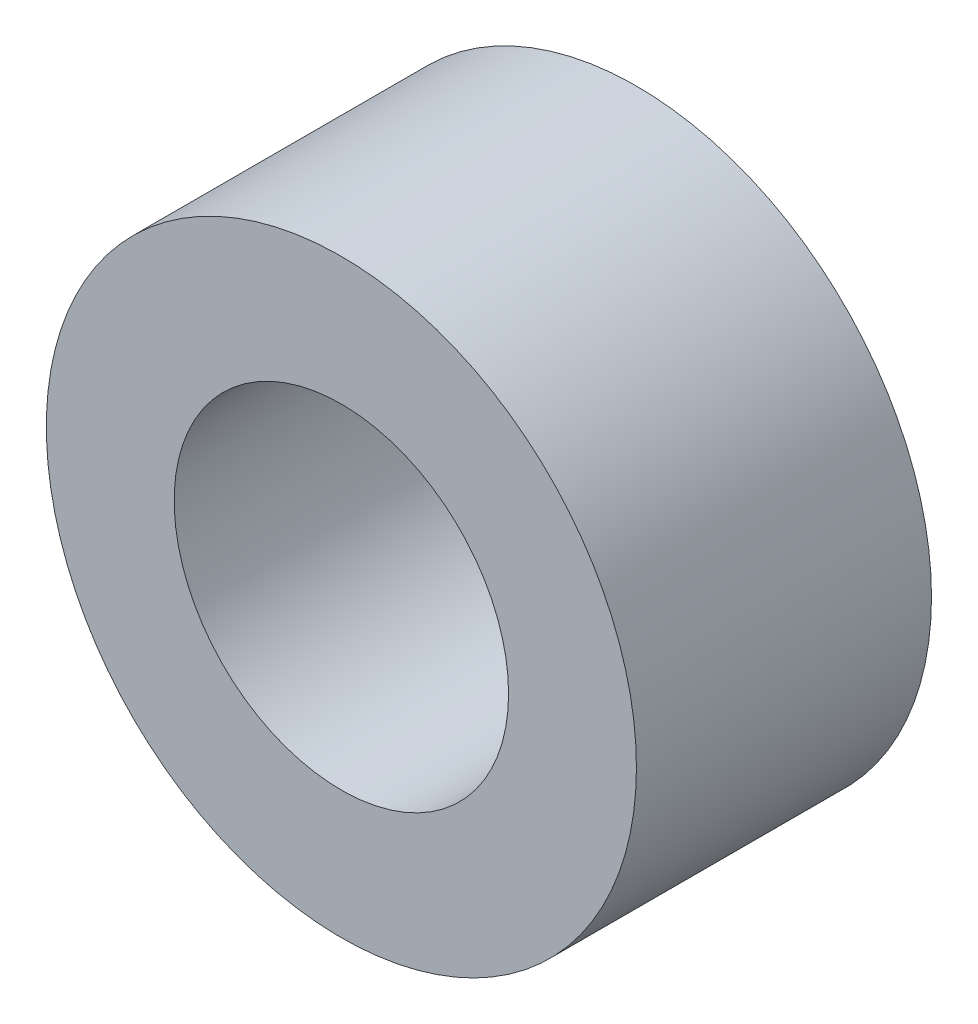
ISO-10303-21;
HEADER;
FILE_DESCRIPTION(('STEP AP214'),'2;1');
FILE_NAME('part.step','',(''),(''),'','','');
FILE_SCHEMA(('AUTOMOTIVE_DESIGN { 1 0 10303 214 1 1 1 1 }'));
ENDSEC;
DATA;
#1=APPLICATION_CONTEXT('core data for automotive mechanical design processes');
#2=APPLICATION_PROTOCOL_DEFINITION('international standard','automotive_design',2000,#1);
#3=PRODUCT_CONTEXT('',#1,'mechanical');
#4=PRODUCT('Part','Part','',(#3));
#5=PRODUCT_RELATED_PRODUCT_CATEGORY('part','',(#4));
#6=PRODUCT_DEFINITION_FORMATION('','',#4);
#7=PRODUCT_DEFINITION_CONTEXT('part definition',#1,'design');
#8=PRODUCT_DEFINITION('design','',#6,#7);
#9=PRODUCT_DEFINITION_SHAPE('','',#8);
#10=(LENGTH_UNIT() NAMED_UNIT(*) SI_UNIT(.MILLI.,.METRE.));
#11=(NAMED_UNIT(*) PLANE_ANGLE_UNIT() SI_UNIT($,.RADIAN.));
#12=(NAMED_UNIT(*) SI_UNIT($,.STERADIAN.) SOLID_ANGLE_UNIT());
#13=UNCERTAINTY_MEASURE_WITH_UNIT(LENGTH_MEASURE(1.E-05),#10,'distance_accuracy_value','');
#14=(GEOMETRIC_REPRESENTATION_CONTEXT(3) GLOBAL_UNCERTAINTY_ASSIGNED_CONTEXT((#13)) GLOBAL_UNIT_ASSIGNED_CONTEXT((#10,
#11,#12)) REPRESENTATION_CONTEXT('',''));
#15=CARTESIAN_POINT('',(0.,0.,0.));
#16=DIRECTION('',(0.,0.,1.));
#17=DIRECTION('',(1.,0.,0.));
#18=AXIS2_PLACEMENT_3D('',#15,#16,#17);
#19=CARTESIAN_POINT('',(-151.5,-27.,48.5));
#20=DIRECTION('',(0.,0.,1.));
#21=DIRECTION('',(1.,0.,0.));
#22=AXIS2_PLACEMENT_3D('',#19,#20,#21);
#23=CYLINDRICAL_SURFACE('',#22,3.);
#24=CARTESIAN_POINT('',(-151.5,-27.,48.5));
#25=DIRECTION('',(0.,0.,1.));
#26=DIRECTION('',(1.,0.,0.));
#27=AXIS2_PLACEMENT_3D('',#24,#25,#26);
#28=CIRCLE('',#27,3.);
#29=CARTESIAN_POINT('',(-148.5,-27.,48.5));
#30=VERTEX_POINT('',#29);
#31=EDGE_CURVE('E10',#30,#30,#28,.T.);
#32=ORIENTED_EDGE('',*,*,#31,.T.);
#33=EDGE_LOOP('',(#32));
#34=FACE_BOUND('',#33,.T.);
#35=CARTESIAN_POINT('',(-151.5,-27.,51.5));
#36=DIRECTION('',(0.,0.,1.));
#37=DIRECTION('',(1.,0.,0.));
#38=AXIS2_PLACEMENT_3D('',#35,#36,#37);
#39=CIRCLE('',#38,3.);
#40=CARTESIAN_POINT('',(-148.5,-27.,51.5));
#41=VERTEX_POINT('',#40);
#42=EDGE_CURVE('E45',#41,#41,#39,.T.);
#43=ORIENTED_EDGE('',*,*,#42,.F.);
#44=EDGE_LOOP('',(#43));
#45=FACE_BOUND('',#44,.T.);
#46=ADVANCED_FACE('F39',(#34,#45),#23,.T.);
#47=CARTESIAN_POINT('',(-151.5,-27.,48.5));
#48=DIRECTION('',(0.,0.,1.));
#49=DIRECTION('',(1.,0.,0.));
#50=AXIS2_PLACEMENT_3D('',#47,#48,#49);
#51=PLANE('',#50);
#52=CARTESIAN_POINT('',(-151.5,-27.,48.5));
#53=DIRECTION('',(0.,0.,1.));
#54=DIRECTION('',(1.,0.,0.));
#55=AXIS2_PLACEMENT_3D('',#52,#53,#54);
#56=CIRCLE('',#55,1.70000000000001);
#57=CARTESIAN_POINT('',(-149.8,-27.,48.5));
#58=VERTEX_POINT('',#57);
#59=EDGE_CURVE('E47',#58,#58,#56,.T.);
#60=ORIENTED_EDGE('',*,*,#59,.T.);
#61=EDGE_LOOP('',(#60));
#62=FACE_BOUND('',#61,.T.);
#63=ORIENTED_EDGE('',*,*,#31,.F.);
#64=EDGE_LOOP('',(#63));
#65=FACE_BOUND('',#64,.T.);
#66=ADVANCED_FACE('F60',(#62,#65),#51,.F.);
#67=CARTESIAN_POINT('',(-151.5,-27.,51.5));
#68=DIRECTION('',(0.,0.,1.));
#69=DIRECTION('',(1.,0.,0.));
#70=AXIS2_PLACEMENT_3D('',#67,#68,#69);
#71=PLANE('',#70);
#72=CARTESIAN_POINT('',(-151.5,-27.,51.5));
#73=DIRECTION('',(0.,0.,1.));
#74=DIRECTION('',(1.,0.,0.));
#75=AXIS2_PLACEMENT_3D('',#72,#73,#74);
#76=CIRCLE('',#75,1.70000000000001);
#77=CARTESIAN_POINT('',(-149.8,-27.,51.5));
#78=VERTEX_POINT('',#77);
#79=EDGE_CURVE('E51',#78,#78,#76,.T.);
#80=ORIENTED_EDGE('',*,*,#79,.F.);
#81=EDGE_LOOP('',(#80));
#82=FACE_BOUND('',#81,.T.);
#83=ORIENTED_EDGE('',*,*,#42,.T.);
#84=EDGE_LOOP('',(#83));
#85=FACE_BOUND('',#84,.T.);
#86=ADVANCED_FACE('F64',(#82,#85),#71,.T.);
#87=CARTESIAN_POINT('',(-151.5,-27.,48.5));
#88=DIRECTION('',(0.,0.,1.));
#89=DIRECTION('',(1.,0.,0.));
#90=AXIS2_PLACEMENT_3D('',#87,#88,#89);
#91=CYLINDRICAL_SURFACE('',#90,1.70000000000001);
#92=ORIENTED_EDGE('',*,*,#59,.F.);
#93=EDGE_LOOP('',(#92));
#94=FACE_BOUND('',#93,.T.);
#95=ORIENTED_EDGE('',*,*,#79,.T.);
#96=EDGE_LOOP('',(#95));
#97=FACE_BOUND('',#96,.T.);
#98=ADVANCED_FACE('F58',(#94,#97),#91,.F.);
#99=CLOSED_SHELL('',(#46,#66,#86,#98));
#100=MANIFOLD_SOLID_BREP('B2',#99);
#101=ADVANCED_BREP_SHAPE_REPRESENTATION('',(#18,#100),#14);
#102=SHAPE_DEFINITION_REPRESENTATION(#9,#101);
ENDSEC;
END-ISO-10303-21;
